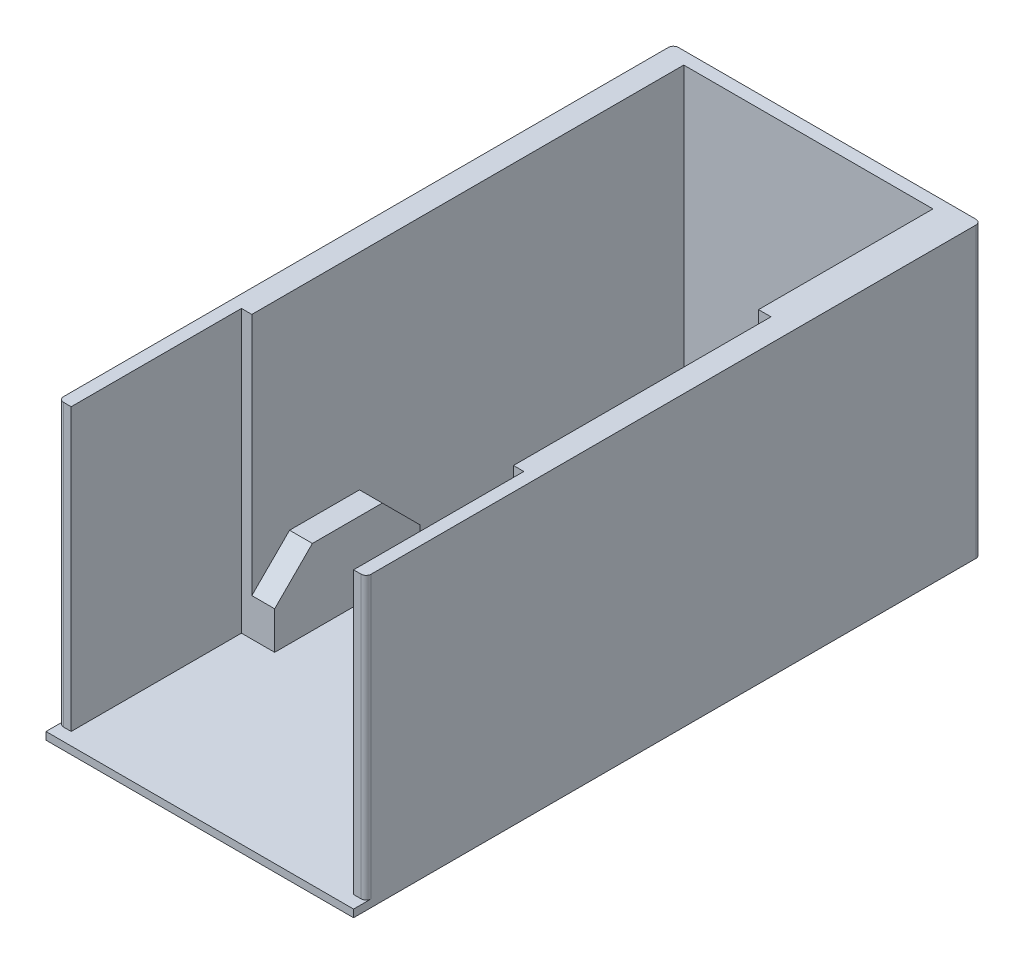
ISO-10303-21;
HEADER;
FILE_DESCRIPTION(('STEP AP214'),'2;1');
FILE_NAME('part.step','',(''),(''),'','','');
FILE_SCHEMA(('AUTOMOTIVE_DESIGN { 1 0 10303 214 1 1 1 1 }'));
ENDSEC;
DATA;
#1=APPLICATION_CONTEXT('core data for automotive mechanical design processes');
#2=APPLICATION_PROTOCOL_DEFINITION('international standard','automotive_design',2000,#1);
#3=PRODUCT_CONTEXT('',#1,'mechanical');
#4=PRODUCT('Part','Part','',(#3));
#5=PRODUCT_RELATED_PRODUCT_CATEGORY('part','',(#4));
#6=PRODUCT_DEFINITION_FORMATION('','',#4);
#7=PRODUCT_DEFINITION_CONTEXT('part definition',#1,'design');
#8=PRODUCT_DEFINITION('design','',#6,#7);
#9=PRODUCT_DEFINITION_SHAPE('','',#8);
#10=(LENGTH_UNIT() NAMED_UNIT(*) SI_UNIT(.MILLI.,.METRE.));
#11=(NAMED_UNIT(*) PLANE_ANGLE_UNIT() SI_UNIT($,.RADIAN.));
#12=(NAMED_UNIT(*) SI_UNIT($,.STERADIAN.) SOLID_ANGLE_UNIT());
#13=UNCERTAINTY_MEASURE_WITH_UNIT(LENGTH_MEASURE(1.E-05),#10,'distance_accuracy_value','');
#14=(GEOMETRIC_REPRESENTATION_CONTEXT(3) GLOBAL_UNCERTAINTY_ASSIGNED_CONTEXT((#13)) GLOBAL_UNIT_ASSIGNED_CONTEXT((#10,
#11,#12)) REPRESENTATION_CONTEXT('',''));
#15=CARTESIAN_POINT('',(0.,0.,0.));
#16=DIRECTION('',(0.,0.,1.));
#17=DIRECTION('',(1.,0.,0.));
#18=AXIS2_PLACEMENT_3D('',#15,#16,#17);
#19=CARTESIAN_POINT('',(-705.1675,30.,0.));
#20=DIRECTION('',(-1.,0.,0.));
#21=DIRECTION('',(0.,0.,1.));
#22=AXIS2_PLACEMENT_3D('',#19,#20,#21);
#23=PLANE('',#22);
#24=DIRECTION('',(0.,0.707106781186545,0.70710678118655));
#25=VECTOR('',#24,1.);
#26=CARTESIAN_POINT('',(-705.1675,1531.6905,-1531.69049999999));
#27=LINE('',#26,#25);
#28=CARTESIAN_POINT('',(-705.1675,14.9999999999996,-3048.381));
#29=VERTEX_POINT('',#28);
#30=CARTESIAN_POINT('',(-705.1675,30.,-3033.381));
#31=VERTEX_POINT('',#30);
#32=EDGE_CURVE('E242',#29,#31,#27,.T.);
#33=ORIENTED_EDGE('',*,*,#32,.F.);
#34=DIRECTION('',(0.,-1.,0.));
#35=VECTOR('',#34,1.);
#36=CARTESIAN_POINT('',(-705.1675,30.,-3048.381));
#37=LINE('',#36,#35);
#38=CARTESIAN_POINT('',(-705.1675,0.,-3048.381));
#39=VERTEX_POINT('',#38);
#40=EDGE_CURVE('E261',#29,#39,#37,.T.);
#41=ORIENTED_EDGE('',*,*,#40,.T.);
#42=DIRECTION('',(0.,0.,-1.));
#43=VECTOR('',#42,1.);
#44=CARTESIAN_POINT('',(-705.1675,0.,0.));
#45=LINE('',#44,#43);
#46=CARTESIAN_POINT('',(-705.1675,0.,-2990.596));
#47=VERTEX_POINT('',#46);
#48=EDGE_CURVE('E269',#47,#39,#45,.T.);
#49=ORIENTED_EDGE('',*,*,#48,.F.);
#50=DIRECTION('',(0.,-1.,0.));
#51=VECTOR('',#50,1.);
#52=CARTESIAN_POINT('',(-705.1675,30.,-2990.596));
#53=LINE('',#52,#51);
#54=CARTESIAN_POINT('',(-705.1675,15.0000000000003,-2990.596));
#55=VERTEX_POINT('',#54);
#56=EDGE_CURVE('E276',#55,#47,#53,.T.);
#57=ORIENTED_EDGE('',*,*,#56,.F.);
#58=DIRECTION('',(0.,0.707106781186556,-0.707106781186539));
#59=VECTOR('',#58,1.);
#60=CARTESIAN_POINT('',(-705.1675,-1487.798,-1487.79800000004));
#61=LINE('',#60,#59);
#62=CARTESIAN_POINT('',(-705.1675,30.,-3005.596));
#63=VERTEX_POINT('',#62);
#64=EDGE_CURVE('E856',#55,#63,#61,.T.);
#65=ORIENTED_EDGE('',*,*,#64,.T.);
#66=DIRECTION('',(0.,0.,-1.));
#67=VECTOR('',#66,1.);
#68=CARTESIAN_POINT('',(-705.1675,30.,0.));
#69=LINE('',#68,#67);
#70=EDGE_CURVE('E262',#63,#31,#69,.T.);
#71=ORIENTED_EDGE('',*,*,#70,.T.);
#72=EDGE_LOOP('',(#33,#41,#49,#57,#65,#71));
#73=FACE_BOUND('',#72,.T.);
#74=ADVANCED_FACE('F41',(#73),#23,.T.);
#75=CARTESIAN_POINT('',(0.,30.,0.));
#76=DIRECTION('',(0.,1.,0.));
#77=DIRECTION('',(0.,0.,1.));
#78=AXIS2_PLACEMENT_3D('',#75,#76,#77);
#79=PLANE('',#78);
#80=DIRECTION('',(-1.,0.,0.));
#81=VECTOR('',#80,1.);
#82=CARTESIAN_POINT('',(-674.873796564403,30.0000000000002,-3033.381));
#83=LINE('',#82,#81);
#84=CARTESIAN_POINT('',(-696.087,30.0000000000002,-3033.381));
#85=VERTEX_POINT('',#84);
#86=EDGE_CURVE('E236',#85,#31,#83,.T.);
#87=ORIENTED_EDGE('',*,*,#86,.T.);
#88=ORIENTED_EDGE('',*,*,#70,.F.);
#89=DIRECTION('',(-1.,0.,0.));
#90=VECTOR('',#89,1.);
#91=CARTESIAN_POINT('',(-674.873796564403,30.,-3005.596));
#92=LINE('',#91,#90);
#93=CARTESIAN_POINT('',(-696.087,30.,-3005.596));
#94=VERTEX_POINT('',#93);
#95=EDGE_CURVE('E260',#94,#63,#92,.T.);
#96=ORIENTED_EDGE('',*,*,#95,.F.);
#97=DIRECTION('',(0.,0.,-1.));
#98=VECTOR('',#97,1.);
#99=CARTESIAN_POINT('',(-696.087,30.,0.));
#100=LINE('',#99,#98);
#101=EDGE_CURVE('E254',#94,#85,#100,.T.);
#102=ORIENTED_EDGE('',*,*,#101,.T.);
#103=EDGE_LOOP('',(#87,#88,#96,#102));
#104=FACE_BOUND('',#103,.T.);
#105=ADVANCED_FACE('F259',(#104),#79,.T.);
#106=CARTESIAN_POINT('',(-791.0195,30.,0.));
#107=DIRECTION('',(-1.,0.,0.));
#108=DIRECTION('',(0.,0.,1.));
#109=AXIS2_PLACEMENT_3D('',#106,#107,#108);
#110=PLANE('',#109);
#111=DIRECTION('',(0.,0.,-1.));
#112=VECTOR('',#111,1.);
#113=CARTESIAN_POINT('',(-791.0195,30.,0.));
#114=LINE('',#113,#112);
#115=CARTESIAN_POINT('',(-791.0195,30.,-3005.596));
#116=VERTEX_POINT('',#115);
#117=CARTESIAN_POINT('',(-791.0195,30.0000000000002,-3033.381));
#118=VERTEX_POINT('',#117);
#119=EDGE_CURVE('E524',#116,#118,#114,.T.);
#120=ORIENTED_EDGE('',*,*,#119,.F.);
#121=DIRECTION('',(0.,0.707106781186556,-0.707106781186539));
#122=VECTOR('',#121,1.);
#123=CARTESIAN_POINT('',(-791.0195,-1487.798,-1487.79800000004));
#124=LINE('',#123,#122);
#125=CARTESIAN_POINT('',(-791.0195,15.0000000000003,-2990.596));
#126=VERTEX_POINT('',#125);
#127=EDGE_CURVE('E537',#126,#116,#124,.T.);
#128=ORIENTED_EDGE('',*,*,#127,.F.);
#129=DIRECTION('',(0.,-1.,0.));
#130=VECTOR('',#129,1.);
#131=CARTESIAN_POINT('',(-791.0195,30.,-2990.596));
#132=LINE('',#131,#130);
#133=CARTESIAN_POINT('',(-791.0195,0.,-2990.596));
#134=VERTEX_POINT('',#133);
#135=EDGE_CURVE('E296',#126,#134,#132,.T.);
#136=ORIENTED_EDGE('',*,*,#135,.T.);
#137=DIRECTION('',(0.,0.,-1.));
#138=VECTOR('',#137,1.);
#139=CARTESIAN_POINT('',(-791.0195,0.,0.));
#140=LINE('',#139,#138);
#141=CARTESIAN_POINT('',(-791.0195,0.,-3048.381));
#142=VERTEX_POINT('',#141);
#143=EDGE_CURVE('E278',#134,#142,#140,.T.);
#144=ORIENTED_EDGE('',*,*,#143,.T.);
#145=DIRECTION('',(0.,-1.,0.));
#146=VECTOR('',#145,1.);
#147=CARTESIAN_POINT('',(-791.0195,30.,-3048.381));
#148=LINE('',#147,#146);
#149=CARTESIAN_POINT('',(-791.0195,14.9999999999996,-3048.381));
#150=VERTEX_POINT('',#149);
#151=EDGE_CURVE('E523',#150,#142,#148,.T.);
#152=ORIENTED_EDGE('',*,*,#151,.F.);
#153=DIRECTION('',(0.,0.707106781186545,0.70710678118655));
#154=VECTOR('',#153,1.);
#155=CARTESIAN_POINT('',(-791.0195,1531.6905,-1531.69049999999));
#156=LINE('',#155,#154);
#157=EDGE_CURVE('E869',#150,#118,#156,.T.);
#158=ORIENTED_EDGE('',*,*,#157,.T.);
#159=EDGE_LOOP('',(#120,#128,#136,#144,#152,#158));
#160=FACE_BOUND('',#159,.T.);
#161=ADVANCED_FACE('F536',(#160),#110,.F.);
#162=CARTESIAN_POINT('',(0.,30.,-3048.381));
#163=DIRECTION('',(0.,0.,-1.));
#164=DIRECTION('',(-1.,0.,0.));
#165=AXIS2_PLACEMENT_3D('',#162,#163,#164);
#166=PLANE('',#165);
#167=DIRECTION('',(0.,-1.,0.));
#168=VECTOR('',#167,1.);
#169=CARTESIAN_POINT('',(-800.1,30.,-3048.381));
#170=LINE('',#169,#168);
#171=CARTESIAN_POINT('',(-800.1,14.9999999999996,-3048.381));
#172=VERTEX_POINT('',#171);
#173=CARTESIAN_POINT('',(-800.1,0.,-3048.381));
#174=VERTEX_POINT('',#173);
#175=EDGE_CURVE('E521',#172,#174,#170,.T.);
#176=ORIENTED_EDGE('',*,*,#175,.F.);
#177=DIRECTION('',(1.,0.,0.));
#178=VECTOR('',#177,1.);
#179=CARTESIAN_POINT('',(-821.313203435597,14.9999999999996,-3048.381));
#180=LINE('',#179,#178);
#181=EDGE_CURVE('E872',#172,#150,#180,.T.);
#182=ORIENTED_EDGE('',*,*,#181,.T.);
#183=ORIENTED_EDGE('',*,*,#151,.T.);
#184=DIRECTION('',(1.,0.,0.));
#185=VECTOR('',#184,1.);
#186=CARTESIAN_POINT('',(0.,0.,-3048.381));
#187=LINE('',#186,#185);
#188=EDGE_CURVE('E515',#174,#142,#187,.T.);
#189=ORIENTED_EDGE('',*,*,#188,.F.);
#190=EDGE_LOOP('',(#176,#182,#183,#189));
#191=FACE_BOUND('',#190,.T.);
#192=ADVANCED_FACE('F519',(#191),#166,.T.);
#193=CARTESIAN_POINT('',(0.,30.,0.));
#194=DIRECTION('',(0.,1.,0.));
#195=DIRECTION('',(0.,0.,1.));
#196=AXIS2_PLACEMENT_3D('',#193,#194,#195);
#197=PLANE('',#196);
#198=DIRECTION('',(1.,0.,0.));
#199=VECTOR('',#198,1.);
#200=CARTESIAN_POINT('',(-821.313203435597,30.,-3005.596));
#201=LINE('',#200,#199);
#202=CARTESIAN_POINT('',(-800.1,30.,-3005.596));
#203=VERTEX_POINT('',#202);
#204=EDGE_CURVE('E862',#203,#116,#201,.T.);
#205=ORIENTED_EDGE('',*,*,#204,.T.);
#206=ORIENTED_EDGE('',*,*,#119,.T.);
#207=DIRECTION('',(1.,0.,0.));
#208=VECTOR('',#207,1.);
#209=CARTESIAN_POINT('',(-821.313203435597,30.0000000000002,-3033.381));
#210=LINE('',#209,#208);
#211=CARTESIAN_POINT('',(-800.1,30.,-3033.381));
#212=VERTEX_POINT('',#211);
#213=EDGE_CURVE('E868',#212,#118,#210,.T.);
#214=ORIENTED_EDGE('',*,*,#213,.F.);
#215=DIRECTION('',(0.,0.,1.));
#216=VECTOR('',#215,1.);
#217=CARTESIAN_POINT('',(-800.1,30.,0.));
#218=LINE('',#217,#216);
#219=EDGE_CURVE('E527',#212,#203,#218,.T.);
#220=ORIENTED_EDGE('',*,*,#219,.T.);
#221=EDGE_LOOP('',(#205,#206,#214,#220));
#222=FACE_BOUND('',#221,.T.);
#223=ADVANCED_FACE('F569',(#222),#197,.T.);
#224=CARTESIAN_POINT('',(0.,0.,0.));
#225=DIRECTION('',(0.,1.,0.));
#226=DIRECTION('',(0.,0.,1.));
#227=AXIS2_PLACEMENT_3D('',#224,#225,#226);
#228=PLANE('',#227);
#229=ORIENTED_EDGE('',*,*,#143,.F.);
#230=DIRECTION('',(1.,0.,0.));
#231=VECTOR('',#230,1.);
#232=CARTESIAN_POINT('',(0.,0.,-2990.596));
#233=LINE('',#232,#231);
#234=CARTESIAN_POINT('',(-804.2275,0.,-2990.596));
#235=VERTEX_POINT('',#234);
#236=EDGE_CURVE('E363',#235,#134,#233,.T.);
#237=ORIENTED_EDGE('',*,*,#236,.F.);
#238=DIRECTION('',(0.,0.,-1.));
#239=VECTOR('',#238,1.);
#240=CARTESIAN_POINT('',(-804.2275,0.,0.));
#241=LINE('',#240,#239);
#242=CARTESIAN_POINT('',(-804.2275,0.,-2922.905));
#243=VERTEX_POINT('',#242);
#244=EDGE_CURVE('E361',#243,#235,#241,.T.);
#245=ORIENTED_EDGE('',*,*,#244,.F.);
#246=DIRECTION('',(-1.,0.,0.));
#247=VECTOR('',#246,1.);
#248=CARTESIAN_POINT('',(0.,0.,-2922.905));
#249=LINE('',#248,#247);
#250=CARTESIAN_POINT('',(-807.2275,0.,-2922.905));
#251=VERTEX_POINT('',#250);
#252=EDGE_CURVE('E358',#243,#251,#249,.T.);
#253=ORIENTED_EDGE('',*,*,#252,.T.);
#254=CARTESIAN_POINT('',(-807.2275,0.,-2924.905));
#255=DIRECTION('',(0.,1.,0.));
#256=DIRECTION('',(0.,0.,1.));
#257=AXIS2_PLACEMENT_3D('',#254,#255,#256);
#258=CIRCLE('',#257,2.);
#259=CARTESIAN_POINT('',(-809.2275,0.,-2924.905));
#260=VERTEX_POINT('',#259);
#261=EDGE_CURVE('E11',#251,#260,#258,.F.);
#262=ORIENTED_EDGE('',*,*,#261,.T.);
#263=DIRECTION('',(0.,0.,-1.));
#264=VECTOR('',#263,1.);
#265=CARTESIAN_POINT('',(-809.2275,0.,-2917.905));
#266=LINE('',#265,#264);
#267=CARTESIAN_POINT('',(-809.2275,0.,-2917.905));
#268=VERTEX_POINT('',#267);
#269=EDGE_CURVE('E62',#268,#260,#266,.T.);
#270=ORIENTED_EDGE('',*,*,#269,.F.);
#271=DIRECTION('',(1.,0.,0.));
#272=VECTOR('',#271,1.);
#273=CARTESIAN_POINT('',(-809.2275,0.,-2917.905));
#274=LINE('',#273,#272);
#275=CARTESIAN_POINT('',(-686.9595,0.,-2917.905));
#276=VERTEX_POINT('',#275);
#277=EDGE_CURVE('E292',#268,#276,#274,.T.);
#278=ORIENTED_EDGE('',*,*,#277,.T.);
#279=DIRECTION('',(0.,0.,-1.));
#280=VECTOR('',#279,1.);
#281=CARTESIAN_POINT('',(-686.9595,0.,-2917.905));
#282=LINE('',#281,#280);
#283=CARTESIAN_POINT('',(-686.9595,0.,-2924.905));
#284=VERTEX_POINT('',#283);
#285=EDGE_CURVE('E295',#276,#284,#282,.T.);
#286=ORIENTED_EDGE('',*,*,#285,.T.);
#287=CARTESIAN_POINT('',(-688.9595,0.,-2924.905));
#288=DIRECTION('',(0.,1.,0.));
#289=DIRECTION('',(0.,0.,1.));
#290=AXIS2_PLACEMENT_3D('',#287,#288,#289);
#291=CIRCLE('',#290,2.);
#292=CARTESIAN_POINT('',(-688.9595,0.,-2922.905));
#293=VERTEX_POINT('',#292);
#294=EDGE_CURVE('E49',#284,#293,#291,.F.);
#295=ORIENTED_EDGE('',*,*,#294,.T.);
#296=DIRECTION('',(1.,0.,0.));
#297=VECTOR('',#296,1.);
#298=CARTESIAN_POINT('',(0.,0.,-2922.905));
#299=LINE('',#298,#297);
#300=CARTESIAN_POINT('',(-691.9595,0.,-2922.905));
#301=VERTEX_POINT('',#300);
#302=EDGE_CURVE('E355',#301,#293,#299,.T.);
#303=ORIENTED_EDGE('',*,*,#302,.F.);
#304=DIRECTION('',(0.,0.,-1.));
#305=VECTOR('',#304,1.);
#306=CARTESIAN_POINT('',(-691.9595,0.,0.));
#307=LINE('',#306,#305);
#308=CARTESIAN_POINT('',(-691.9595,0.,-2990.596));
#309=VERTEX_POINT('',#308);
#310=EDGE_CURVE('E352',#301,#309,#307,.T.);
#311=ORIENTED_EDGE('',*,*,#310,.T.);
#312=DIRECTION('',(1.,0.,0.));
#313=VECTOR('',#312,1.);
#314=CARTESIAN_POINT('',(0.,0.,-2990.596));
#315=LINE('',#314,#313);
#316=EDGE_CURVE('E349',#47,#309,#315,.T.);
#317=ORIENTED_EDGE('',*,*,#316,.F.);
#318=ORIENTED_EDGE('',*,*,#48,.T.);
#319=DIRECTION('',(1.,0.,0.));
#320=VECTOR('',#319,1.);
#321=CARTESIAN_POINT('',(0.,0.,-3048.381));
#322=LINE('',#321,#320);
#323=CARTESIAN_POINT('',(-696.087,0.,-3048.381));
#324=VERTEX_POINT('',#323);
#325=EDGE_CURVE('E265',#39,#324,#322,.T.);
#326=ORIENTED_EDGE('',*,*,#325,.T.);
#327=DIRECTION('',(0.,0.,1.));
#328=VECTOR('',#327,1.);
#329=CARTESIAN_POINT('',(-696.087,0.,0.));
#330=LINE('',#329,#328);
#331=CARTESIAN_POINT('',(-696.087,0.,-3092.958));
#332=VERTEX_POINT('',#331);
#333=EDGE_CURVE('E347',#332,#324,#330,.T.);
#334=ORIENTED_EDGE('',*,*,#333,.F.);
#335=DIRECTION('',(1.,0.,0.));
#336=VECTOR('',#335,1.);
#337=CARTESIAN_POINT('',(0.,0.,-3092.958));
#338=LINE('',#337,#336);
#339=CARTESIAN_POINT('',(-701.04,0.,-3092.958));
#340=VERTEX_POINT('',#339);
#341=EDGE_CURVE('E345',#340,#332,#338,.T.);
#342=ORIENTED_EDGE('',*,*,#341,.F.);
#343=DIRECTION('',(0.,0.,-1.));
#344=VECTOR('',#343,1.);
#345=CARTESIAN_POINT('',(-701.04,0.,0.));
#346=LINE('',#345,#344);
#347=CARTESIAN_POINT('',(-701.04,0.,-3162.3));
#348=VERTEX_POINT('',#347);
#349=EDGE_CURVE('E342',#340,#348,#346,.T.);
#350=ORIENTED_EDGE('',*,*,#349,.T.);
#351=DIRECTION('',(1.,0.,0.));
#352=VECTOR('',#351,1.);
#353=CARTESIAN_POINT('',(0.,0.,-3162.3));
#354=LINE('',#353,#352);
#355=CARTESIAN_POINT('',(-800.1,0.,-3162.3));
#356=VERTEX_POINT('',#355);
#357=EDGE_CURVE('E301',#356,#348,#354,.T.);
#358=ORIENTED_EDGE('',*,*,#357,.F.);
#359=DIRECTION('',(0.,0.,1.));
#360=VECTOR('',#359,1.);
#361=CARTESIAN_POINT('',(-800.1,0.,0.));
#362=LINE('',#361,#360);
#363=EDGE_CURVE('E306',#356,#174,#362,.T.);
#364=ORIENTED_EDGE('',*,*,#363,.T.);
#365=ORIENTED_EDGE('',*,*,#188,.T.);
#366=EDGE_LOOP('',(#229,#237,#245,#253,#262,#270,#278,#286,#295,#303,#311,#317,#318,#326,#334,
#342,#350,#358,#364,#365));
#367=FACE_BOUND('',#366,.T.);
#368=ADVANCED_FACE('F424',(#367),#228,.T.);
#369=CARTESIAN_POINT('',(0.,111.8,-3162.3));
#370=DIRECTION('',(0.,0.,-1.));
#371=DIRECTION('',(-1.,0.,0.));
#372=AXIS2_PLACEMENT_3D('',#369,#370,#371);
#373=PLANE('',#372);
#374=ORIENTED_EDGE('',*,*,#357,.T.);
#375=DIRECTION('',(0.,-1.,0.));
#376=VECTOR('',#375,1.);
#377=CARTESIAN_POINT('',(-701.04,111.8,-3162.3));
#378=LINE('',#377,#376);
#379=CARTESIAN_POINT('',(-701.04,111.8,-3162.3));
#380=VERTEX_POINT('',#379);
#381=EDGE_CURVE('E387',#380,#348,#378,.T.);
#382=ORIENTED_EDGE('',*,*,#381,.F.);
#383=DIRECTION('',(1.,0.,0.));
#384=VECTOR('',#383,1.);
#385=CARTESIAN_POINT('',(0.,111.8,-3162.3));
#386=LINE('',#385,#384);
#387=CARTESIAN_POINT('',(-800.1,111.8,-3162.3));
#388=VERTEX_POINT('',#387);
#389=EDGE_CURVE('E303',#388,#380,#386,.T.);
#390=ORIENTED_EDGE('',*,*,#389,.F.);
#391=DIRECTION('',(0.,-1.,0.));
#392=VECTOR('',#391,1.);
#393=CARTESIAN_POINT('',(-800.1,111.8,-3162.3));
#394=LINE('',#393,#392);
#395=EDGE_CURVE('E340',#388,#356,#394,.T.);
#396=ORIENTED_EDGE('',*,*,#395,.T.);
#397=EDGE_LOOP('',(#374,#382,#390,#396));
#398=FACE_BOUND('',#397,.T.);
#399=ADVANCED_FACE('F485',(#398),#373,.F.);
#400=CARTESIAN_POINT('',(-701.04,111.8,0.));
#401=DIRECTION('',(-1.,0.,0.));
#402=DIRECTION('',(0.,0.,1.));
#403=AXIS2_PLACEMENT_3D('',#400,#401,#402);
#404=PLANE('',#403);
#405=ORIENTED_EDGE('',*,*,#349,.F.);
#406=DIRECTION('',(0.,-1.,0.));
#407=VECTOR('',#406,1.);
#408=CARTESIAN_POINT('',(-701.04,111.8,-3092.958));
#409=LINE('',#408,#407);
#410=CARTESIAN_POINT('',(-701.04,111.8,-3092.958));
#411=VERTEX_POINT('',#410);
#412=EDGE_CURVE('E385',#411,#340,#409,.T.);
#413=ORIENTED_EDGE('',*,*,#412,.F.);
#414=DIRECTION('',(0.,0.,-1.));
#415=VECTOR('',#414,1.);
#416=CARTESIAN_POINT('',(-701.04,111.8,0.));
#417=LINE('',#416,#415);
#418=EDGE_CURVE('E305',#411,#380,#417,.T.);
#419=ORIENTED_EDGE('',*,*,#418,.T.);
#420=ORIENTED_EDGE('',*,*,#381,.T.);
#421=EDGE_LOOP('',(#405,#413,#419,#420));
#422=FACE_BOUND('',#421,.T.);
#423=ADVANCED_FACE('F491',(#422),#404,.T.);
#424=CARTESIAN_POINT('',(0.,111.8,-3092.958));
#425=DIRECTION('',(0.,0.,-1.));
#426=DIRECTION('',(-1.,0.,0.));
#427=AXIS2_PLACEMENT_3D('',#424,#425,#426);
#428=PLANE('',#427);
#429=ORIENTED_EDGE('',*,*,#341,.T.);
#430=DIRECTION('',(0.,-1.,0.));
#431=VECTOR('',#430,1.);
#432=CARTESIAN_POINT('',(-696.087,111.8,-3092.958));
#433=LINE('',#432,#431);
#434=CARTESIAN_POINT('',(-696.087,111.8,-3092.958));
#435=VERTEX_POINT('',#434);
#436=EDGE_CURVE('E382',#435,#332,#433,.T.);
#437=ORIENTED_EDGE('',*,*,#436,.F.);
#438=DIRECTION('',(1.,0.,0.));
#439=VECTOR('',#438,1.);
#440=CARTESIAN_POINT('',(0.,111.8,-3092.958));
#441=LINE('',#440,#439);
#442=EDGE_CURVE('E309',#411,#435,#441,.T.);
#443=ORIENTED_EDGE('',*,*,#442,.F.);
#444=ORIENTED_EDGE('',*,*,#412,.T.);
#445=EDGE_LOOP('',(#429,#437,#443,#444));
#446=FACE_BOUND('',#445,.T.);
#447=ADVANCED_FACE('F494',(#446),#428,.F.);
#448=CARTESIAN_POINT('',(-696.087,111.8,0.));
#449=DIRECTION('',(1.,0.,0.));
#450=DIRECTION('',(0.,0.,-1.));
#451=AXIS2_PLACEMENT_3D('',#448,#449,#450);
#452=PLANE('',#451);
#453=DIRECTION('',(0.,-1.,0.));
#454=VECTOR('',#453,1.);
#455=CARTESIAN_POINT('',(-696.087,30.,-3048.381));
#456=LINE('',#455,#454);
#457=CARTESIAN_POINT('',(-696.087,14.9999999999997,-3048.381));
#458=VERTEX_POINT('',#457);
#459=EDGE_CURVE('E256',#458,#324,#456,.T.);
#460=ORIENTED_EDGE('',*,*,#459,.F.);
#461=DIRECTION('',(0.,0.707106781186545,0.70710678118655));
#462=VECTOR('',#461,1.);
#463=CARTESIAN_POINT('',(-696.087,1531.6905,-1531.69049999999));
#464=LINE('',#463,#462);
#465=EDGE_CURVE('E239',#458,#85,#464,.T.);
#466=ORIENTED_EDGE('',*,*,#465,.T.);
#467=ORIENTED_EDGE('',*,*,#101,.F.);
#468=DIRECTION('',(0.,0.707106781186556,-0.707106781186539));
#469=VECTOR('',#468,1.);
#470=CARTESIAN_POINT('',(-696.087,-1487.798,-1487.79800000004));
#471=LINE('',#470,#469);
#472=CARTESIAN_POINT('',(-696.087,15.0000000000003,-2990.596));
#473=VERTEX_POINT('',#472);
#474=EDGE_CURVE('E850',#473,#94,#471,.T.);
#475=ORIENTED_EDGE('',*,*,#474,.F.);
#476=DIRECTION('',(0.,-1.,0.));
#477=VECTOR('',#476,1.);
#478=CARTESIAN_POINT('',(-696.087,111.8,-2990.596));
#479=LINE('',#478,#477);
#480=CARTESIAN_POINT('',(-696.087,111.8,-2990.596));
#481=VERTEX_POINT('',#480);
#482=EDGE_CURVE('E380',#481,#473,#479,.T.);
#483=ORIENTED_EDGE('',*,*,#482,.F.);
#484=DIRECTION('',(0.,0.,1.));
#485=VECTOR('',#484,1.);
#486=CARTESIAN_POINT('',(-696.087,111.8,0.));
#487=LINE('',#486,#485);
#488=EDGE_CURVE('E311',#435,#481,#487,.T.);
#489=ORIENTED_EDGE('',*,*,#488,.F.);
#490=ORIENTED_EDGE('',*,*,#436,.T.);
#491=ORIENTED_EDGE('',*,*,#333,.T.);
#492=EDGE_LOOP('',(#460,#466,#467,#475,#483,#489,#490,#491));
#493=FACE_BOUND('',#492,.T.);
#494=ADVANCED_FACE('F252',(#493),#452,.F.);
#495=CARTESIAN_POINT('',(0.,111.8,-2990.596));
#496=DIRECTION('',(0.,0.,-1.));
#497=DIRECTION('',(-1.,0.,0.));
#498=AXIS2_PLACEMENT_3D('',#495,#496,#497);
#499=PLANE('',#498);
#500=ORIENTED_EDGE('',*,*,#482,.T.);
#501=DIRECTION('',(-1.,0.,0.));
#502=VECTOR('',#501,1.);
#503=CARTESIAN_POINT('',(-674.873796564403,15.0000000000003,-2990.596));
#504=LINE('',#503,#502);
#505=EDGE_CURVE('E852',#473,#55,#504,.T.);
#506=ORIENTED_EDGE('',*,*,#505,.T.);
#507=ORIENTED_EDGE('',*,*,#56,.T.);
#508=ORIENTED_EDGE('',*,*,#316,.T.);
#509=DIRECTION('',(0.,-1.,0.));
#510=VECTOR('',#509,1.);
#511=CARTESIAN_POINT('',(-691.9595,111.8,-2990.596));
#512=LINE('',#511,#510);
#513=CARTESIAN_POINT('',(-691.9595,111.8,-2990.596));
#514=VERTEX_POINT('',#513);
#515=EDGE_CURVE('E378',#514,#309,#512,.T.);
#516=ORIENTED_EDGE('',*,*,#515,.F.);
#517=DIRECTION('',(1.,0.,0.));
#518=VECTOR('',#517,1.);
#519=CARTESIAN_POINT('',(0.,111.8,-2990.596));
#520=LINE('',#519,#518);
#521=EDGE_CURVE('E313',#481,#514,#520,.T.);
#522=ORIENTED_EDGE('',*,*,#521,.F.);
#523=EDGE_LOOP('',(#500,#506,#507,#508,#516,#522));
#524=FACE_BOUND('',#523,.T.);
#525=ADVANCED_FACE('F501',(#524),#499,.F.);
#526=CARTESIAN_POINT('',(-691.9595,111.8,0.));
#527=DIRECTION('',(-1.,0.,0.));
#528=DIRECTION('',(0.,0.,1.));
#529=AXIS2_PLACEMENT_3D('',#526,#527,#528);
#530=PLANE('',#529);
#531=ORIENTED_EDGE('',*,*,#310,.F.);
#532=DIRECTION('',(0.,-1.,0.));
#533=VECTOR('',#532,1.);
#534=CARTESIAN_POINT('',(-691.9595,111.8,-2922.905));
#535=LINE('',#534,#533);
#536=CARTESIAN_POINT('',(-691.9595,111.8,-2922.905));
#537=VERTEX_POINT('',#536);
#538=EDGE_CURVE('E376',#537,#301,#535,.T.);
#539=ORIENTED_EDGE('',*,*,#538,.F.);
#540=DIRECTION('',(0.,0.,-1.));
#541=VECTOR('',#540,1.);
#542=CARTESIAN_POINT('',(-691.9595,111.8,0.));
#543=LINE('',#542,#541);
#544=EDGE_CURVE('E315',#537,#514,#543,.T.);
#545=ORIENTED_EDGE('',*,*,#544,.T.);
#546=ORIENTED_EDGE('',*,*,#515,.T.);
#547=EDGE_LOOP('',(#531,#539,#545,#546));
#548=FACE_BOUND('',#547,.T.);
#549=ADVANCED_FACE('F504',(#548),#530,.T.);
#550=CARTESIAN_POINT('',(0.,111.8,-2922.905));
#551=DIRECTION('',(0.,0.,-1.));
#552=DIRECTION('',(-1.,0.,0.));
#553=AXIS2_PLACEMENT_3D('',#550,#551,#552);
#554=PLANE('',#553);
#555=ORIENTED_EDGE('',*,*,#302,.T.);
#556=DIRECTION('',(0.,-1.,0.));
#557=VECTOR('',#556,1.);
#558=CARTESIAN_POINT('',(-688.9595,111.8,-2922.905));
#559=LINE('',#558,#557);
#560=CARTESIAN_POINT('',(-688.9595,111.8,-2922.905));
#561=VERTEX_POINT('',#560);
#562=EDGE_CURVE('E395',#293,#561,#559,.F.);
#563=ORIENTED_EDGE('',*,*,#562,.T.);
#564=DIRECTION('',(1.,0.,0.));
#565=VECTOR('',#564,1.);
#566=CARTESIAN_POINT('',(0.,111.8,-2922.905));
#567=LINE('',#566,#565);
#568=EDGE_CURVE('E318',#537,#561,#567,.T.);
#569=ORIENTED_EDGE('',*,*,#568,.F.);
#570=ORIENTED_EDGE('',*,*,#538,.T.);
#571=EDGE_LOOP('',(#555,#563,#569,#570));
#572=FACE_BOUND('',#571,.T.);
#573=ADVANCED_FACE('F430',(#572),#554,.F.);
#574=CARTESIAN_POINT('',(-686.9595,111.8,0.));
#575=DIRECTION('',(-1.,0.,0.));
#576=DIRECTION('',(0.,0.,1.));
#577=AXIS2_PLACEMENT_3D('',#574,#575,#576);
#578=PLANE('',#577);
#579=DIRECTION('',(0.,0.,-1.));
#580=VECTOR('',#579,1.);
#581=CARTESIAN_POINT('',(-686.9595,111.8,0.));
#582=LINE('',#581,#580);
#583=CARTESIAN_POINT('',(-686.9595,111.8,-2924.905));
#584=VERTEX_POINT('',#583);
#585=CARTESIAN_POINT('',(-686.9595,111.8,-3165.3));
#586=VERTEX_POINT('',#585);
#587=EDGE_CURVE('E321',#584,#586,#582,.T.);
#588=ORIENTED_EDGE('',*,*,#587,.F.);
#589=DIRECTION('',(0.,-1.,0.));
#590=VECTOR('',#589,1.);
#591=CARTESIAN_POINT('',(-686.9595,111.8,-2924.905));
#592=LINE('',#591,#590);
#593=EDGE_CURVE('E392',#584,#284,#592,.T.);
#594=ORIENTED_EDGE('',*,*,#593,.T.);
#595=ORIENTED_EDGE('',*,*,#285,.F.);
#596=DIRECTION('',(0.,1.,0.));
#597=VECTOR('',#596,1.);
#598=CARTESIAN_POINT('',(-686.9595,-3.,-2917.905));
#599=LINE('',#598,#597);
#600=CARTESIAN_POINT('',(-686.9595,-3.,-2917.905));
#601=VERTEX_POINT('',#600);
#602=EDGE_CURVE('E291',#601,#276,#599,.T.);
#603=ORIENTED_EDGE('',*,*,#602,.F.);
#604=DIRECTION('',(0.,0.,-1.));
#605=VECTOR('',#604,1.);
#606=CARTESIAN_POINT('',(-686.9595,-3.,-2917.905));
#607=LINE('',#606,#605);
#608=CARTESIAN_POINT('',(-686.9595,-3.,-3165.3));
#609=VERTEX_POINT('',#608);
#610=EDGE_CURVE('E282',#601,#609,#607,.T.);
#611=ORIENTED_EDGE('',*,*,#610,.T.);
#612=DIRECTION('',(0.,-1.,0.));
#613=VECTOR('',#612,1.);
#614=CARTESIAN_POINT('',(-686.9595,111.8,-3165.3));
#615=LINE('',#614,#613);
#616=EDGE_CURVE('E390',#609,#586,#615,.F.);
#617=ORIENTED_EDGE('',*,*,#616,.T.);
#618=EDGE_LOOP('',(#588,#594,#595,#603,#611,#617));
#619=FACE_BOUND('',#618,.T.);
#620=ADVANCED_FACE('F441',(#619),#578,.F.);
#621=CARTESIAN_POINT('',(0.,111.8,-3167.3));
#622=DIRECTION('',(0.,0.,1.));
#623=DIRECTION('',(1.,0.,0.));
#624=AXIS2_PLACEMENT_3D('',#621,#622,#623);
#625=PLANE('',#624);
#626=DIRECTION('',(-1.,0.,0.));
#627=VECTOR('',#626,1.);
#628=CARTESIAN_POINT('',(0.,111.8,-3167.3));
#629=LINE('',#628,#627);
#630=CARTESIAN_POINT('',(-688.9595,111.8,-3167.3));
#631=VERTEX_POINT('',#630);
#632=CARTESIAN_POINT('',(-807.2275,111.8,-3167.3));
#633=VERTEX_POINT('',#632);
#634=EDGE_CURVE('E324',#631,#633,#629,.T.);
#635=ORIENTED_EDGE('',*,*,#634,.F.);
#636=DIRECTION('',(0.,-1.,0.));
#637=VECTOR('',#636,1.);
#638=CARTESIAN_POINT('',(-688.9595,111.8,-3167.3));
#639=LINE('',#638,#637);
#640=CARTESIAN_POINT('',(-688.9595,-3.,-3167.3));
#641=VERTEX_POINT('',#640);
#642=EDGE_CURVE('E407',#631,#641,#639,.T.);
#643=ORIENTED_EDGE('',*,*,#642,.T.);
#644=DIRECTION('',(-1.,0.,0.));
#645=VECTOR('',#644,1.);
#646=CARTESIAN_POINT('',(-686.9595,-3.,-3167.3));
#647=LINE('',#646,#645);
#648=CARTESIAN_POINT('',(-807.2275,-3.,-3167.3));
#649=VERTEX_POINT('',#648);
#650=EDGE_CURVE('E285',#641,#649,#647,.T.);
#651=ORIENTED_EDGE('',*,*,#650,.T.);
#652=DIRECTION('',(0.,-1.,0.));
#653=VECTOR('',#652,1.);
#654=CARTESIAN_POINT('',(-807.2275,111.8,-3167.3));
#655=LINE('',#654,#653);
#656=EDGE_CURVE('E405',#649,#633,#655,.F.);
#657=ORIENTED_EDGE('',*,*,#656,.T.);
#658=EDGE_LOOP('',(#635,#643,#651,#657));
#659=FACE_BOUND('',#658,.T.);
#660=ADVANCED_FACE('F450',(#659),#625,.F.);
#661=CARTESIAN_POINT('',(-809.2275,111.8,0.));
#662=DIRECTION('',(-1.,0.,0.));
#663=DIRECTION('',(0.,0.,1.));
#664=AXIS2_PLACEMENT_3D('',#661,#662,#663);
#665=PLANE('',#664);
#666=DIRECTION('',(0.,0.,-1.));
#667=VECTOR('',#666,1.);
#668=CARTESIAN_POINT('',(-809.2275,111.8,0.));
#669=LINE('',#668,#667);
#670=CARTESIAN_POINT('',(-809.2275,111.8,-2924.905));
#671=VERTEX_POINT('',#670);
#672=CARTESIAN_POINT('',(-809.2275,111.8,-3165.3));
#673=VERTEX_POINT('',#672);
#674=EDGE_CURVE('E327',#671,#673,#669,.T.);
#675=ORIENTED_EDGE('',*,*,#674,.T.);
#676=DIRECTION('',(0.,-1.,0.));
#677=VECTOR('',#676,1.);
#678=CARTESIAN_POINT('',(-809.2275,-3.,-3165.3));
#679=LINE('',#678,#677);
#680=CARTESIAN_POINT('',(-809.2275,-3.,-3165.3));
#681=VERTEX_POINT('',#680);
#682=EDGE_CURVE('E416',#673,#681,#679,.T.);
#683=ORIENTED_EDGE('',*,*,#682,.T.);
#684=DIRECTION('',(0.,0.,-1.));
#685=VECTOR('',#684,1.);
#686=CARTESIAN_POINT('',(-809.2275,-3.,-2917.905));
#687=LINE('',#686,#685);
#688=CARTESIAN_POINT('',(-809.2275,-3.,-2917.905));
#689=VERTEX_POINT('',#688);
#690=EDGE_CURVE('E288',#689,#681,#687,.T.);
#691=ORIENTED_EDGE('',*,*,#690,.F.);
#692=DIRECTION('',(0.,1.,0.));
#693=VECTOR('',#692,1.);
#694=CARTESIAN_POINT('',(-809.2275,-3.,-2917.905));
#695=LINE('',#694,#693);
#696=EDGE_CURVE('E299',#689,#268,#695,.T.);
#697=ORIENTED_EDGE('',*,*,#696,.T.);
#698=ORIENTED_EDGE('',*,*,#269,.T.);
#699=DIRECTION('',(0.,-1.,0.));
#700=VECTOR('',#699,1.);
#701=CARTESIAN_POINT('',(-809.2275,111.8,-2924.905));
#702=LINE('',#701,#700);
#703=EDGE_CURVE('E414',#260,#671,#702,.F.);
#704=ORIENTED_EDGE('',*,*,#703,.T.);
#705=EDGE_LOOP('',(#675,#683,#691,#697,#698,#704));
#706=FACE_BOUND('',#705,.T.);
#707=ADVANCED_FACE('F458',(#706),#665,.T.);
#708=CARTESIAN_POINT('',(0.,111.8,-2922.905));
#709=DIRECTION('',(0.,0.,1.));
#710=DIRECTION('',(1.,0.,0.));
#711=AXIS2_PLACEMENT_3D('',#708,#709,#710);
#712=PLANE('',#711);
#713=DIRECTION('',(-1.,0.,0.));
#714=VECTOR('',#713,1.);
#715=CARTESIAN_POINT('',(0.,111.8,-2922.905));
#716=LINE('',#715,#714);
#717=CARTESIAN_POINT('',(-804.2275,111.8,-2922.905));
#718=VERTEX_POINT('',#717);
#719=CARTESIAN_POINT('',(-807.2275,111.8,-2922.905));
#720=VERTEX_POINT('',#719);
#721=EDGE_CURVE('E330',#718,#720,#716,.T.);
#722=ORIENTED_EDGE('',*,*,#721,.T.);
#723=DIRECTION('',(0.,-1.,0.));
#724=VECTOR('',#723,1.);
#725=CARTESIAN_POINT('',(-807.2275,111.8,-2922.905));
#726=LINE('',#725,#724);
#727=EDGE_CURVE('E419',#720,#251,#726,.T.);
#728=ORIENTED_EDGE('',*,*,#727,.T.);
#729=ORIENTED_EDGE('',*,*,#252,.F.);
#730=DIRECTION('',(0.,-1.,0.));
#731=VECTOR('',#730,1.);
#732=CARTESIAN_POINT('',(-804.2275,111.8,-2922.905));
#733=LINE('',#732,#731);
#734=EDGE_CURVE('E374',#718,#243,#733,.T.);
#735=ORIENTED_EDGE('',*,*,#734,.F.);
#736=EDGE_LOOP('',(#722,#728,#729,#735));
#737=FACE_BOUND('',#736,.T.);
#738=ADVANCED_FACE('F462',(#737),#712,.T.);
#739=CARTESIAN_POINT('',(-804.2275,111.8,0.));
#740=DIRECTION('',(-1.,0.,0.));
#741=DIRECTION('',(0.,0.,1.));
#742=AXIS2_PLACEMENT_3D('',#739,#740,#741);
#743=PLANE('',#742);
#744=ORIENTED_EDGE('',*,*,#244,.T.);
#745=DIRECTION('',(0.,-1.,0.));
#746=VECTOR('',#745,1.);
#747=CARTESIAN_POINT('',(-804.2275,111.8,-2990.596));
#748=LINE('',#747,#746);
#749=CARTESIAN_POINT('',(-804.2275,111.8,-2990.596));
#750=VERTEX_POINT('',#749);
#751=EDGE_CURVE('E371',#750,#235,#748,.T.);
#752=ORIENTED_EDGE('',*,*,#751,.F.);
#753=DIRECTION('',(0.,0.,-1.));
#754=VECTOR('',#753,1.);
#755=CARTESIAN_POINT('',(-804.2275,111.8,0.));
#756=LINE('',#755,#754);
#757=EDGE_CURVE('E333',#718,#750,#756,.T.);
#758=ORIENTED_EDGE('',*,*,#757,.F.);
#759=ORIENTED_EDGE('',*,*,#734,.T.);
#760=EDGE_LOOP('',(#744,#752,#758,#759));
#761=FACE_BOUND('',#760,.T.);
#762=ADVANCED_FACE('F468',(#761),#743,.F.);
#763=CARTESIAN_POINT('',(0.,111.8,-2990.596));
#764=DIRECTION('',(0.,0.,-1.));
#765=DIRECTION('',(-1.,0.,0.));
#766=AXIS2_PLACEMENT_3D('',#763,#764,#765);
#767=PLANE('',#766);
#768=ORIENTED_EDGE('',*,*,#135,.F.);
#769=DIRECTION('',(1.,0.,0.));
#770=VECTOR('',#769,1.);
#771=CARTESIAN_POINT('',(-821.313203435597,15.0000000000003,-2990.596));
#772=LINE('',#771,#770);
#773=CARTESIAN_POINT('',(-800.1,15.0000000000001,-2990.596));
#774=VERTEX_POINT('',#773);
#775=EDGE_CURVE('E476',#774,#126,#772,.T.);
#776=ORIENTED_EDGE('',*,*,#775,.F.);
#777=DIRECTION('',(0.,-1.,0.));
#778=VECTOR('',#777,1.);
#779=CARTESIAN_POINT('',(-800.1,111.8,-2990.596));
#780=LINE('',#779,#778);
#781=CARTESIAN_POINT('',(-800.1,111.8,-2990.596));
#782=VERTEX_POINT('',#781);
#783=EDGE_CURVE('E369',#782,#774,#780,.T.);
#784=ORIENTED_EDGE('',*,*,#783,.F.);
#785=DIRECTION('',(1.,0.,0.));
#786=VECTOR('',#785,1.);
#787=CARTESIAN_POINT('',(0.,111.8,-2990.596));
#788=LINE('',#787,#786);
#789=EDGE_CURVE('E335',#750,#782,#788,.T.);
#790=ORIENTED_EDGE('',*,*,#789,.F.);
#791=ORIENTED_EDGE('',*,*,#751,.T.);
#792=ORIENTED_EDGE('',*,*,#236,.T.);
#793=EDGE_LOOP('',(#768,#776,#784,#790,#791,#792));
#794=FACE_BOUND('',#793,.T.);
#795=ADVANCED_FACE('F475',(#794),#767,.F.);
#796=CARTESIAN_POINT('',(-800.1,111.8,0.));
#797=DIRECTION('',(1.,0.,0.));
#798=DIRECTION('',(0.,0.,-1.));
#799=AXIS2_PLACEMENT_3D('',#796,#797,#798);
#800=PLANE('',#799);
#801=DIRECTION('',(0.,-0.707106781186545,-0.70710678118655));
#802=VECTOR('',#801,1.);
#803=CARTESIAN_POINT('',(-800.1,1531.6905,-1531.69049999999));
#804=LINE('',#803,#802);
#805=EDGE_CURVE('E861',#212,#172,#804,.T.);
#806=ORIENTED_EDGE('',*,*,#805,.T.);
#807=ORIENTED_EDGE('',*,*,#175,.T.);
#808=ORIENTED_EDGE('',*,*,#363,.F.);
#809=ORIENTED_EDGE('',*,*,#395,.F.);
#810=DIRECTION('',(0.,0.,1.));
#811=VECTOR('',#810,1.);
#812=CARTESIAN_POINT('',(-800.1,111.8,0.));
#813=LINE('',#812,#811);
#814=EDGE_CURVE('E337',#388,#782,#813,.T.);
#815=ORIENTED_EDGE('',*,*,#814,.T.);
#816=ORIENTED_EDGE('',*,*,#783,.T.);
#817=DIRECTION('',(0.,-0.707106781186556,0.707106781186539));
#818=VECTOR('',#817,1.);
#819=CARTESIAN_POINT('',(-800.1,-1487.798,-1487.79800000004));
#820=LINE('',#819,#818);
#821=EDGE_CURVE('E272',#203,#774,#820,.T.);
#822=ORIENTED_EDGE('',*,*,#821,.F.);
#823=ORIENTED_EDGE('',*,*,#219,.F.);
#824=EDGE_LOOP('',(#806,#807,#808,#809,#815,#816,#822,#823));
#825=FACE_BOUND('',#824,.T.);
#826=ADVANCED_FACE('F479',(#825),#800,.T.);
#827=CARTESIAN_POINT('',(0.,111.8,0.));
#828=DIRECTION('',(0.,1.,0.));
#829=DIRECTION('',(0.,0.,1.));
#830=AXIS2_PLACEMENT_3D('',#827,#828,#829);
#831=PLANE('',#830);
#832=ORIENTED_EDGE('',*,*,#568,.T.);
#833=CARTESIAN_POINT('',(-688.9595,111.8,-2924.905));
#834=DIRECTION('',(0.,1.,0.));
#835=DIRECTION('',(0.,0.,1.));
#836=AXIS2_PLACEMENT_3D('',#833,#834,#835);
#837=CIRCLE('',#836,2.);
#838=EDGE_CURVE('E403',#561,#584,#837,.T.);
#839=ORIENTED_EDGE('',*,*,#838,.T.);
#840=ORIENTED_EDGE('',*,*,#587,.T.);
#841=CARTESIAN_POINT('',(-688.9595,111.8,-3165.3));
#842=DIRECTION('',(0.,1.,0.));
#843=DIRECTION('',(0.,0.,1.));
#844=AXIS2_PLACEMENT_3D('',#841,#842,#843);
#845=CIRCLE('',#844,2.);
#846=EDGE_CURVE('E401',#586,#631,#845,.T.);
#847=ORIENTED_EDGE('',*,*,#846,.T.);
#848=ORIENTED_EDGE('',*,*,#634,.T.);
#849=CARTESIAN_POINT('',(-807.2275,111.8,-3165.3));
#850=DIRECTION('',(0.,1.,0.));
#851=DIRECTION('',(0.,0.,1.));
#852=AXIS2_PLACEMENT_3D('',#849,#850,#851);
#853=CIRCLE('',#852,2.);
#854=EDGE_CURVE('E399',#633,#673,#853,.T.);
#855=ORIENTED_EDGE('',*,*,#854,.T.);
#856=ORIENTED_EDGE('',*,*,#674,.F.);
#857=CARTESIAN_POINT('',(-807.2275,111.8,-2924.905));
#858=DIRECTION('',(0.,1.,0.));
#859=DIRECTION('',(0.,0.,1.));
#860=AXIS2_PLACEMENT_3D('',#857,#858,#859);
#861=CIRCLE('',#860,2.);
#862=EDGE_CURVE('E397',#671,#720,#861,.T.);
#863=ORIENTED_EDGE('',*,*,#862,.T.);
#864=ORIENTED_EDGE('',*,*,#721,.F.);
#865=ORIENTED_EDGE('',*,*,#757,.T.);
#866=ORIENTED_EDGE('',*,*,#789,.T.);
#867=ORIENTED_EDGE('',*,*,#814,.F.);
#868=ORIENTED_EDGE('',*,*,#389,.T.);
#869=ORIENTED_EDGE('',*,*,#418,.F.);
#870=ORIENTED_EDGE('',*,*,#442,.T.);
#871=ORIENTED_EDGE('',*,*,#488,.T.);
#872=ORIENTED_EDGE('',*,*,#521,.T.);
#873=ORIENTED_EDGE('',*,*,#544,.F.);
#874=EDGE_LOOP('',(#832,#839,#840,#847,#848,#855,#856,#863,#864,#865,#866,#867,#868,#869,#870,
#871,#872,#873));
#875=FACE_BOUND('',#874,.T.);
#876=ADVANCED_FACE('F437',(#875),#831,.T.);
#877=CARTESIAN_POINT('',(-809.2275,-3.,-2917.905));
#878=DIRECTION('',(0.,0.,1.));
#879=DIRECTION('',(1.,0.,0.));
#880=AXIS2_PLACEMENT_3D('',#877,#878,#879);
#881=PLANE('',#880);
#882=ORIENTED_EDGE('',*,*,#277,.F.);
#883=ORIENTED_EDGE('',*,*,#696,.F.);
#884=DIRECTION('',(1.,0.,0.));
#885=VECTOR('',#884,1.);
#886=CARTESIAN_POINT('',(-809.2275,-3.,-2917.905));
#887=LINE('',#886,#885);
#888=EDGE_CURVE('E279',#689,#601,#887,.T.);
#889=ORIENTED_EDGE('',*,*,#888,.T.);
#890=ORIENTED_EDGE('',*,*,#602,.T.);
#891=EDGE_LOOP('',(#882,#883,#889,#890));
#892=FACE_BOUND('',#891,.T.);
#893=ADVANCED_FACE('F541',(#892),#881,.T.);
#894=CARTESIAN_POINT('',(0.,-3.,0.));
#895=DIRECTION('',(0.,1.,0.));
#896=DIRECTION('',(0.,0.,1.));
#897=AXIS2_PLACEMENT_3D('',#894,#895,#896);
#898=PLANE('',#897);
#899=ORIENTED_EDGE('',*,*,#650,.F.);
#900=CARTESIAN_POINT('',(-688.9595,-3.,-3165.3));
#901=DIRECTION('',(0.,1.,0.));
#902=DIRECTION('',(0.,0.,1.));
#903=AXIS2_PLACEMENT_3D('',#900,#901,#902);
#904=CIRCLE('',#903,2.);
#905=EDGE_CURVE('E412',#641,#609,#904,.F.);
#906=ORIENTED_EDGE('',*,*,#905,.T.);
#907=ORIENTED_EDGE('',*,*,#610,.F.);
#908=ORIENTED_EDGE('',*,*,#888,.F.);
#909=ORIENTED_EDGE('',*,*,#690,.T.);
#910=CARTESIAN_POINT('',(-807.2275,-3.,-3165.3));
#911=DIRECTION('',(0.,1.,0.));
#912=DIRECTION('',(0.,0.,1.));
#913=AXIS2_PLACEMENT_3D('',#910,#911,#912);
#914=CIRCLE('',#913,2.);
#915=EDGE_CURVE('E410',#681,#649,#914,.F.);
#916=ORIENTED_EDGE('',*,*,#915,.T.);
#917=EDGE_LOOP('',(#899,#906,#907,#908,#909,#916));
#918=FACE_BOUND('',#917,.T.);
#919=ADVANCED_FACE('F544',(#918),#898,.F.);
#920=CARTESIAN_POINT('',(0.,30.,-3048.381));
#921=DIRECTION('',(0.,0.,-1.));
#922=DIRECTION('',(-1.,0.,0.));
#923=AXIS2_PLACEMENT_3D('',#920,#921,#922);
#924=PLANE('',#923);
#925=DIRECTION('',(-1.,0.,0.));
#926=VECTOR('',#925,1.);
#927=CARTESIAN_POINT('',(-674.873796564403,14.9999999999996,-3048.381));
#928=LINE('',#927,#926);
#929=EDGE_CURVE('E247',#458,#29,#928,.T.);
#930=ORIENTED_EDGE('',*,*,#929,.F.);
#931=ORIENTED_EDGE('',*,*,#459,.T.);
#932=ORIENTED_EDGE('',*,*,#325,.F.);
#933=ORIENTED_EDGE('',*,*,#40,.F.);
#934=EDGE_LOOP('',(#930,#931,#932,#933));
#935=FACE_BOUND('',#934,.T.);
#936=ADVANCED_FACE('F512',(#935),#924,.T.);
#937=CARTESIAN_POINT('',(-821.313203435597,1531.6905,-1531.69049999999));
#938=DIRECTION('',(0.,0.70710678118655,-0.707106781186545));
#939=DIRECTION('',(0.,0.707106781186545,0.70710678118655));
#940=AXIS2_PLACEMENT_3D('',#937,#938,#939);
#941=PLANE('',#940);
#942=ORIENTED_EDGE('',*,*,#213,.T.);
#943=ORIENTED_EDGE('',*,*,#157,.F.);
#944=ORIENTED_EDGE('',*,*,#181,.F.);
#945=ORIENTED_EDGE('',*,*,#805,.F.);
#946=EDGE_LOOP('',(#942,#943,#944,#945));
#947=FACE_BOUND('',#946,.T.);
#948=ADVANCED_FACE('F552',(#947),#941,.T.);
#949=CARTESIAN_POINT('',(-821.313203435597,-1487.798,-1487.79800000004));
#950=DIRECTION('',(0.,-0.707106781186539,-0.707106781186556));
#951=DIRECTION('',(0.,0.707106781186556,-0.707106781186539));
#952=AXIS2_PLACEMENT_3D('',#949,#950,#951);
#953=PLANE('',#952);
#954=ORIENTED_EDGE('',*,*,#821,.T.);
#955=ORIENTED_EDGE('',*,*,#775,.T.);
#956=ORIENTED_EDGE('',*,*,#127,.T.);
#957=ORIENTED_EDGE('',*,*,#204,.F.);
#958=EDGE_LOOP('',(#954,#955,#956,#957));
#959=FACE_BOUND('',#958,.T.);
#960=ADVANCED_FACE('F575',(#959),#953,.F.);
#961=CARTESIAN_POINT('',(-674.873796564403,-1487.798,-1487.79800000004));
#962=DIRECTION('',(0.,0.707106781186539,0.707106781186556));
#963=DIRECTION('',(0.,-0.707106781186556,0.707106781186539));
#964=AXIS2_PLACEMENT_3D('',#961,#962,#963);
#965=PLANE('',#964);
#966=ORIENTED_EDGE('',*,*,#474,.T.);
#967=ORIENTED_EDGE('',*,*,#95,.T.);
#968=ORIENTED_EDGE('',*,*,#64,.F.);
#969=ORIENTED_EDGE('',*,*,#505,.F.);
#970=EDGE_LOOP('',(#966,#967,#968,#969));
#971=FACE_BOUND('',#970,.T.);
#972=ADVANCED_FACE('F578',(#971),#965,.T.);
#973=CARTESIAN_POINT('',(-674.873796564403,1531.6905,-1531.69049999999));
#974=DIRECTION('',(0.,-0.70710678118655,0.707106781186545));
#975=DIRECTION('',(0.,-0.707106781186545,-0.70710678118655));
#976=AXIS2_PLACEMENT_3D('',#973,#974,#975);
#977=PLANE('',#976);
#978=ORIENTED_EDGE('',*,*,#929,.T.);
#979=ORIENTED_EDGE('',*,*,#32,.T.);
#980=ORIENTED_EDGE('',*,*,#86,.F.);
#981=ORIENTED_EDGE('',*,*,#465,.F.);
#982=EDGE_LOOP('',(#978,#979,#980,#981));
#983=FACE_BOUND('',#982,.T.);
#984=ADVANCED_FACE('F238',(#983),#977,.F.);
#985=CARTESIAN_POINT('',(-688.9595,111.8,-2924.905));
#986=DIRECTION('',(0.,-1.,0.));
#987=DIRECTION('',(0.,0.,-1.));
#988=AXIS2_PLACEMENT_3D('',#985,#986,#987);
#989=CYLINDRICAL_SURFACE('',#988,2.);
#990=ORIENTED_EDGE('',*,*,#838,.F.);
#991=ORIENTED_EDGE('',*,*,#562,.F.);
#992=ORIENTED_EDGE('',*,*,#294,.F.);
#993=ORIENTED_EDGE('',*,*,#593,.F.);
#994=EDGE_LOOP('',(#990,#991,#992,#993));
#995=FACE_BOUND('',#994,.T.);
#996=ADVANCED_FACE('F434',(#995),#989,.T.);
#997=CARTESIAN_POINT('',(-688.9595,111.8,-3165.3));
#998=DIRECTION('',(0.,-1.,0.));
#999=DIRECTION('',(0.,0.,-1.));
#1000=AXIS2_PLACEMENT_3D('',#997,#998,#999);
#1001=CYLINDRICAL_SURFACE('',#1000,2.);
#1002=ORIENTED_EDGE('',*,*,#846,.F.);
#1003=ORIENTED_EDGE('',*,*,#616,.F.);
#1004=ORIENTED_EDGE('',*,*,#905,.F.);
#1005=ORIENTED_EDGE('',*,*,#642,.F.);
#1006=EDGE_LOOP('',(#1002,#1003,#1004,#1005));
#1007=FACE_BOUND('',#1006,.T.);
#1008=ADVANCED_FACE('F445',(#1007),#1001,.T.);
#1009=CARTESIAN_POINT('',(-807.2275,111.8,-3165.3));
#1010=DIRECTION('',(0.,1.,0.));
#1011=DIRECTION('',(0.,0.,1.));
#1012=AXIS2_PLACEMENT_3D('',#1009,#1010,#1011);
#1013=CYLINDRICAL_SURFACE('',#1012,2.);
#1014=ORIENTED_EDGE('',*,*,#854,.F.);
#1015=ORIENTED_EDGE('',*,*,#656,.F.);
#1016=ORIENTED_EDGE('',*,*,#915,.F.);
#1017=ORIENTED_EDGE('',*,*,#682,.F.);
#1018=EDGE_LOOP('',(#1014,#1015,#1016,#1017));
#1019=FACE_BOUND('',#1018,.T.);
#1020=ADVANCED_FACE('F454',(#1019),#1013,.T.);
#1021=CARTESIAN_POINT('',(-807.2275,111.8,-2924.905));
#1022=DIRECTION('',(0.,-1.,0.));
#1023=DIRECTION('',(0.,0.,-1.));
#1024=AXIS2_PLACEMENT_3D('',#1021,#1022,#1023);
#1025=CYLINDRICAL_SURFACE('',#1024,2.);
#1026=ORIENTED_EDGE('',*,*,#862,.F.);
#1027=ORIENTED_EDGE('',*,*,#703,.F.);
#1028=ORIENTED_EDGE('',*,*,#261,.F.);
#1029=ORIENTED_EDGE('',*,*,#727,.F.);
#1030=EDGE_LOOP('',(#1026,#1027,#1028,#1029));
#1031=FACE_BOUND('',#1030,.T.);
#1032=ADVANCED_FACE('F43',(#1031),#1025,.T.);
#1033=CLOSED_SHELL('',(#74,#105,#161,#192,#223,#368,#399,#423,#447,#494,#525,#549,#573,#620,
#660,#707,#738,#762,#795,#826,#876,#893,#919,#936,#948,#960,#972,#984,#996,#1008,#1020,#1032));
#1034=MANIFOLD_SOLID_BREP('B2',#1033);
#1035=ADVANCED_BREP_SHAPE_REPRESENTATION('',(#18,#1034),#14);
#1036=SHAPE_DEFINITION_REPRESENTATION(#9,#1035);
ENDSEC;
END-ISO-10303-21;
